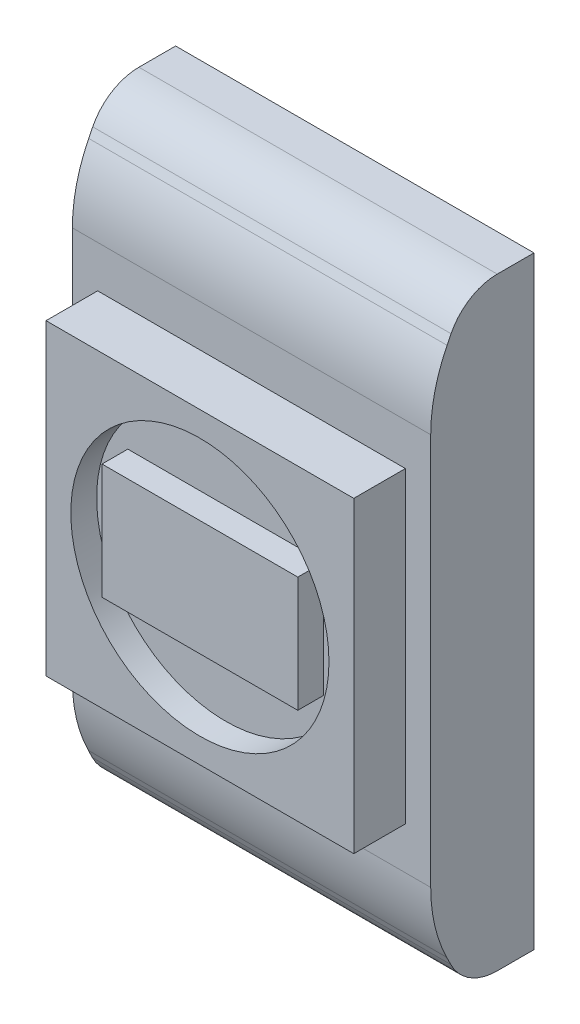
ISO-10303-21;
HEADER;
FILE_DESCRIPTION(('STEP AP214'),'2;1');
FILE_NAME('part.step','',(''),(''),'','','');
FILE_SCHEMA(('AUTOMOTIVE_DESIGN { 1 0 10303 214 1 1 1 1 }'));
ENDSEC;
DATA;
#1=APPLICATION_CONTEXT('core data for automotive mechanical design processes');
#2=APPLICATION_PROTOCOL_DEFINITION('international standard','automotive_design',2000,#1);
#3=PRODUCT_CONTEXT('',#1,'mechanical');
#4=PRODUCT('Part','Part','',(#3));
#5=PRODUCT_RELATED_PRODUCT_CATEGORY('part','',(#4));
#6=PRODUCT_DEFINITION_FORMATION('','',#4);
#7=PRODUCT_DEFINITION_CONTEXT('part definition',#1,'design');
#8=PRODUCT_DEFINITION('design','',#6,#7);
#9=PRODUCT_DEFINITION_SHAPE('','',#8);
#10=(LENGTH_UNIT() NAMED_UNIT(*) SI_UNIT(.MILLI.,.METRE.));
#11=(NAMED_UNIT(*) PLANE_ANGLE_UNIT() SI_UNIT($,.RADIAN.));
#12=(NAMED_UNIT(*) SI_UNIT($,.STERADIAN.) SOLID_ANGLE_UNIT());
#13=UNCERTAINTY_MEASURE_WITH_UNIT(LENGTH_MEASURE(1.E-05),#10,'distance_accuracy_value','');
#14=(GEOMETRIC_REPRESENTATION_CONTEXT(3) GLOBAL_UNCERTAINTY_ASSIGNED_CONTEXT((#13)) GLOBAL_UNIT_ASSIGNED_CONTEXT((#10,
#11,#12)) REPRESENTATION_CONTEXT('',''));
#15=CARTESIAN_POINT('',(0.,0.,0.));
#16=DIRECTION('',(0.,0.,1.));
#17=DIRECTION('',(1.,0.,0.));
#18=AXIS2_PLACEMENT_3D('',#15,#16,#17);
#19=CARTESIAN_POINT('',(0.,0.,0.5));
#20=DIRECTION('',(0.,0.,1.));
#21=DIRECTION('',(1.,0.,0.));
#22=AXIS2_PLACEMENT_3D('',#19,#20,#21);
#23=PLANE('',#22);
#24=CARTESIAN_POINT('',(0.,0.,0.5));
#25=DIRECTION('',(0.,0.,1.));
#26=DIRECTION('',(1.,0.,0.));
#27=AXIS2_PLACEMENT_3D('',#24,#25,#26);
#28=CIRCLE('',#27,2.5);
#29=CARTESIAN_POINT('',(2.5,0.,0.5));
#30=VERTEX_POINT('',#29);
#31=EDGE_CURVE('E197',#30,#30,#28,.T.);
#32=ORIENTED_EDGE('',*,*,#31,.T.);
#33=EDGE_LOOP('',(#32));
#34=FACE_BOUND('',#33,.T.);
#35=DIRECTION('',(1.,0.,0.));
#36=VECTOR('',#35,1.);
#37=CARTESIAN_POINT('',(-1.89583920539964,-1.11748368411723,0.5));
#38=LINE('',#37,#36);
#39=CARTESIAN_POINT('',(-1.89583920539964,-1.11748368411723,0.5));
#40=VERTEX_POINT('',#39);
#41=CARTESIAN_POINT('',(1.89583920539964,-1.11748368411723,0.5));
#42=VERTEX_POINT('',#41);
#43=EDGE_CURVE('E163',#40,#42,#38,.T.);
#44=ORIENTED_EDGE('',*,*,#43,.F.);
#45=DIRECTION('',(0.,1.,0.));
#46=VECTOR('',#45,1.);
#47=CARTESIAN_POINT('',(-1.89583920539964,-1.11748368411723,0.5));
#48=LINE('',#47,#46);
#49=CARTESIAN_POINT('',(-1.89583920539964,1.11748368411723,0.5));
#50=VERTEX_POINT('',#49);
#51=EDGE_CURVE('E55',#40,#50,#48,.T.);
#52=ORIENTED_EDGE('',*,*,#51,.T.);
#53=DIRECTION('',(1.,0.,0.));
#54=VECTOR('',#53,1.);
#55=CARTESIAN_POINT('',(-1.89583920539964,1.11748368411723,0.5));
#56=LINE('',#55,#54);
#57=CARTESIAN_POINT('',(1.89583920539964,1.11748368411723,0.5));
#58=VERTEX_POINT('',#57);
#59=EDGE_CURVE('E59',#50,#58,#56,.T.);
#60=ORIENTED_EDGE('',*,*,#59,.T.);
#61=DIRECTION('',(0.,1.,0.));
#62=VECTOR('',#61,1.);
#63=CARTESIAN_POINT('',(1.89583920539964,-1.11748368411723,0.5));
#64=LINE('',#63,#62);
#65=EDGE_CURVE('E160',#42,#58,#64,.T.);
#66=ORIENTED_EDGE('',*,*,#65,.F.);
#67=EDGE_LOOP('',(#44,#52,#60,#66));
#68=FACE_BOUND('',#67,.T.);
#69=ADVANCED_FACE('F40',(#34,#68),#23,.T.);
#70=CARTESIAN_POINT('',(0.,0.,0.));
#71=DIRECTION('',(0.,0.,1.));
#72=DIRECTION('',(1.,0.,0.));
#73=AXIS2_PLACEMENT_3D('',#70,#71,#72);
#74=PLANE('',#73);
#75=DIRECTION('',(0.,-1.,0.));
#76=VECTOR('',#75,1.);
#77=CARTESIAN_POINT('',(3.47,4.5,0.));
#78=LINE('',#77,#76);
#79=CARTESIAN_POINT('',(3.47,3.7919356750098,0.));
#80=VERTEX_POINT('',#79);
#81=CARTESIAN_POINT('',(3.47,-3.80022207023988,0.));
#82=VERTEX_POINT('',#81);
#83=EDGE_CURVE('E265',#80,#82,#78,.T.);
#84=ORIENTED_EDGE('',*,*,#83,.F.);
#85=DIRECTION('',(-1.,0.,0.));
#86=VECTOR('',#85,1.);
#87=CARTESIAN_POINT('',(0.,3.7919356750098,0.));
#88=LINE('',#87,#86);
#89=CARTESIAN_POINT('',(-3.47,3.7919356750098,0.));
#90=VERTEX_POINT('',#89);
#91=EDGE_CURVE('E292',#80,#90,#88,.T.);
#92=ORIENTED_EDGE('',*,*,#91,.T.);
#93=DIRECTION('',(0.,-1.,0.));
#94=VECTOR('',#93,1.);
#95=CARTESIAN_POINT('',(-3.47,4.5,0.));
#96=LINE('',#95,#94);
#97=CARTESIAN_POINT('',(-3.47,-3.80022207023988,0.));
#98=VERTEX_POINT('',#97);
#99=EDGE_CURVE('E261',#90,#98,#96,.T.);
#100=ORIENTED_EDGE('',*,*,#99,.T.);
#101=DIRECTION('',(-1.,0.,0.));
#102=VECTOR('',#101,1.);
#103=CARTESIAN_POINT('',(0.,-3.80022207023988,0.));
#104=LINE('',#103,#102);
#105=EDGE_CURVE('E273',#98,#82,#104,.F.);
#106=ORIENTED_EDGE('',*,*,#105,.T.);
#107=EDGE_LOOP('',(#84,#92,#100,#106));
#108=FACE_BOUND('',#107,.T.);
#109=DIRECTION('',(1.,0.,0.));
#110=VECTOR('',#109,1.);
#111=CARTESIAN_POINT('',(-2.98,-2.98,0.));
#112=LINE('',#111,#110);
#113=CARTESIAN_POINT('',(-2.98,-2.98,0.));
#114=VERTEX_POINT('',#113);
#115=CARTESIAN_POINT('',(2.98,-2.98,0.));
#116=VERTEX_POINT('',#115);
#117=EDGE_CURVE('E218',#114,#116,#112,.T.);
#118=ORIENTED_EDGE('',*,*,#117,.F.);
#119=DIRECTION('',(0.,-1.,0.));
#120=VECTOR('',#119,1.);
#121=CARTESIAN_POINT('',(-2.98,2.98,0.));
#122=LINE('',#121,#120);
#123=CARTESIAN_POINT('',(-2.98,2.98,0.));
#124=VERTEX_POINT('',#123);
#125=EDGE_CURVE('E200',#124,#114,#122,.T.);
#126=ORIENTED_EDGE('',*,*,#125,.F.);
#127=DIRECTION('',(1.,0.,0.));
#128=VECTOR('',#127,1.);
#129=CARTESIAN_POINT('',(-2.98,2.98,0.));
#130=LINE('',#129,#128);
#131=CARTESIAN_POINT('',(2.98,2.98,0.));
#132=VERTEX_POINT('',#131);
#133=EDGE_CURVE('E207',#124,#132,#130,.T.);
#134=ORIENTED_EDGE('',*,*,#133,.T.);
#135=DIRECTION('',(0.,-1.,0.));
#136=VECTOR('',#135,1.);
#137=CARTESIAN_POINT('',(2.98,2.98,0.));
#138=LINE('',#137,#136);
#139=EDGE_CURVE('E221',#132,#116,#138,.T.);
#140=ORIENTED_EDGE('',*,*,#139,.T.);
#141=EDGE_LOOP('',(#118,#126,#134,#140));
#142=FACE_BOUND('',#141,.T.);
#143=ADVANCED_FACE('F330',(#108,#142),#74,.T.);
#144=CARTESIAN_POINT('',(0.,4.84169992059135,-1.28879701927679));
#145=DIRECTION('',(1.,0.,0.));
#146=DIRECTION('',(0.,0.,-1.));
#147=AXIS2_PLACEMENT_3D('',#144,#145,#146);
#148=CYLINDRICAL_SURFACE('',#147,1.);
#149=DIRECTION('',(-1.,0.,0.));
#150=VECTOR('',#149,1.);
#151=CARTESIAN_POINT('',(0.,5.28883466194651,-0.394330405549231));
#152=LINE('',#151,#150);
#153=CARTESIAN_POINT('',(3.47,5.28883466194651,-0.394330405549231));
#154=VERTEX_POINT('',#153);
#155=CARTESIAN_POINT('',(-3.47,5.28883466194651,-0.394330405549231));
#156=VERTEX_POINT('',#155);
#157=EDGE_CURVE('E302',#154,#156,#152,.T.);
#158=ORIENTED_EDGE('',*,*,#157,.F.);
#159=CARTESIAN_POINT('',(3.47,4.84169992059135,-1.28879701927679));
#160=DIRECTION('',(-1.,0.,0.));
#161=DIRECTION('',(0.,0.,1.));
#162=AXIS2_PLACEMENT_3D('',#159,#160,#161);
#163=CIRCLE('',#162,1.);
#164=CARTESIAN_POINT('',(3.47,5.84169992059135,-1.28879701927679));
#165=VERTEX_POINT('',#164);
#166=EDGE_CURVE('E48',#165,#154,#163,.F.);
#167=ORIENTED_EDGE('',*,*,#166,.F.);
#168=DIRECTION('',(-1.,0.,0.));
#169=VECTOR('',#168,1.);
#170=CARTESIAN_POINT('',(0.,5.84169992059135,-1.28879701927679));
#171=LINE('',#170,#169);
#172=CARTESIAN_POINT('',(-3.47,5.84169992059135,-1.28879701927679));
#173=VERTEX_POINT('',#172);
#174=EDGE_CURVE('E305',#173,#165,#171,.F.);
#175=ORIENTED_EDGE('',*,*,#174,.F.);
#176=CARTESIAN_POINT('',(-3.47,4.84169992059135,-1.28879701927679));
#177=DIRECTION('',(-1.,0.,0.));
#178=DIRECTION('',(0.,0.,1.));
#179=AXIS2_PLACEMENT_3D('',#176,#177,#178);
#180=CIRCLE('',#179,1.);
#181=EDGE_CURVE('E11',#156,#173,#180,.T.);
#182=ORIENTED_EDGE('',*,*,#181,.F.);
#183=EDGE_LOOP('',(#158,#167,#175,#182));
#184=FACE_BOUND('',#183,.T.);
#185=ADVANCED_FACE('F42',(#184),#148,.T.);
#186=CARTESIAN_POINT('',(0.,3.7919356750098,-3.));
#187=DIRECTION('',(1.,0.,0.));
#188=DIRECTION('',(0.,0.,-1.));
#189=AXIS2_PLACEMENT_3D('',#186,#187,#188);
#190=CYLINDRICAL_SURFACE('',#189,3.);
#191=ORIENTED_EDGE('',*,*,#91,.F.);
#192=CARTESIAN_POINT('',(3.47,3.7919356750098,-3.));
#193=DIRECTION('',(-1.,0.,0.));
#194=DIRECTION('',(0.,0.,1.));
#195=AXIS2_PLACEMENT_3D('',#192,#193,#194);
#196=CIRCLE('',#195,3.);
#197=CARTESIAN_POINT('',(3.47,5.13333989907528,-0.316600158817312));
#198=VERTEX_POINT('',#197);
#199=EDGE_CURVE('E298',#198,#80,#196,.F.);
#200=ORIENTED_EDGE('',*,*,#199,.F.);
#201=DIRECTION('',(-1.,0.,0.));
#202=VECTOR('',#201,1.);
#203=CARTESIAN_POINT('',(0.,5.13333989907528,-0.316600158817312));
#204=LINE('',#203,#202);
#205=CARTESIAN_POINT('',(-3.47,5.13333989907528,-0.316600158817312));
#206=VERTEX_POINT('',#205);
#207=EDGE_CURVE('E295',#206,#198,#204,.F.);
#208=ORIENTED_EDGE('',*,*,#207,.F.);
#209=CARTESIAN_POINT('',(-3.47,3.7919356750098,-3.));
#210=DIRECTION('',(-1.,0.,0.));
#211=DIRECTION('',(0.,0.,1.));
#212=AXIS2_PLACEMENT_3D('',#209,#210,#211);
#213=CIRCLE('',#212,3.);
#214=EDGE_CURVE('E300',#90,#206,#213,.T.);
#215=ORIENTED_EDGE('',*,*,#214,.F.);
#216=EDGE_LOOP('',(#191,#200,#208,#215));
#217=FACE_BOUND('',#216,.T.);
#218=ADVANCED_FACE('F321',(#217),#190,.T.);
#219=CARTESIAN_POINT('',(0.,-4.84519330090106,-1.28538678150257));
#220=DIRECTION('',(1.,0.,0.));
#221=DIRECTION('',(0.,0.,-1.));
#222=AXIS2_PLACEMENT_3D('',#219,#220,#221);
#223=CYLINDRICAL_SURFACE('',#222,1.);
#224=DIRECTION('',(1.,0.,0.));
#225=VECTOR('',#224,1.);
#226=CARTESIAN_POINT('',(0.,-5.28763851820593,-0.388591247568523));
#227=LINE('',#226,#225);
#228=CARTESIAN_POINT('',(-3.47,-5.28763851820593,-0.388591247568524));
#229=VERTEX_POINT('',#228);
#230=CARTESIAN_POINT('',(3.47,-5.28763851820593,-0.388591247568524));
#231=VERTEX_POINT('',#230);
#232=EDGE_CURVE('E282',#229,#231,#227,.T.);
#233=ORIENTED_EDGE('',*,*,#232,.F.);
#234=CARTESIAN_POINT('',(-3.47,-4.84519330090106,-1.28538678150257));
#235=DIRECTION('',(-1.,0.,0.));
#236=DIRECTION('',(0.,0.,1.));
#237=AXIS2_PLACEMENT_3D('',#234,#235,#236);
#238=CIRCLE('',#237,1.);
#239=CARTESIAN_POINT('',(-3.47,-5.84519330090106,-1.28538678150257));
#240=VERTEX_POINT('',#239);
#241=EDGE_CURVE('E288',#240,#229,#238,.T.);
#242=ORIENTED_EDGE('',*,*,#241,.F.);
#243=DIRECTION('',(1.,0.,0.));
#244=VECTOR('',#243,1.);
#245=CARTESIAN_POINT('',(5.36613519986597,-5.84519330090106,-1.28538678150257));
#246=LINE('',#245,#244);
#247=CARTESIAN_POINT('',(3.47,-5.84519330090106,-1.28538678150257));
#248=VERTEX_POINT('',#247);
#249=EDGE_CURVE('E285',#248,#240,#246,.F.);
#250=ORIENTED_EDGE('',*,*,#249,.F.);
#251=CARTESIAN_POINT('',(3.47,-4.84519330090106,-1.28538678150257));
#252=DIRECTION('',(-1.,0.,0.));
#253=DIRECTION('',(0.,0.,1.));
#254=AXIS2_PLACEMENT_3D('',#251,#252,#253);
#255=CIRCLE('',#254,1.);
#256=EDGE_CURVE('E290',#231,#248,#255,.F.);
#257=ORIENTED_EDGE('',*,*,#256,.F.);
#258=EDGE_LOOP('',(#233,#242,#250,#257));
#259=FACE_BOUND('',#258,.T.);
#260=ADVANCED_FACE('F342',(#259),#223,.T.);
#261=CARTESIAN_POINT('',(0.,-3.80022207023988,-3.));
#262=DIRECTION('',(-1.,0.,0.));
#263=DIRECTION('',(0.,0.,1.));
#264=AXIS2_PLACEMENT_3D('',#261,#262,#263);
#265=CYLINDRICAL_SURFACE('',#264,3.);
#266=DIRECTION('',(-1.,0.,0.));
#267=VECTOR('',#266,1.);
#268=CARTESIAN_POINT('',(0.,-5.12755772215449,-0.30961339819787));
#269=LINE('',#268,#267);
#270=CARTESIAN_POINT('',(3.47,-5.12755772215449,-0.309613398197869));
#271=VERTEX_POINT('',#270);
#272=CARTESIAN_POINT('',(-3.47,-5.12755772215449,-0.309613398197869));
#273=VERTEX_POINT('',#272);
#274=EDGE_CURVE('E268',#271,#273,#269,.T.);
#275=ORIENTED_EDGE('',*,*,#274,.F.);
#276=CARTESIAN_POINT('',(3.47,-3.80022207023988,-3.));
#277=DIRECTION('',(-1.,0.,0.));
#278=DIRECTION('',(0.,0.,1.));
#279=AXIS2_PLACEMENT_3D('',#276,#277,#278);
#280=CIRCLE('',#279,3.);
#281=EDGE_CURVE('E276',#82,#271,#280,.F.);
#282=ORIENTED_EDGE('',*,*,#281,.F.);
#283=ORIENTED_EDGE('',*,*,#105,.F.);
#284=CARTESIAN_POINT('',(-3.47,-3.80022207023988,-3.));
#285=DIRECTION('',(-1.,0.,0.));
#286=DIRECTION('',(0.,0.,1.));
#287=AXIS2_PLACEMENT_3D('',#284,#285,#286);
#288=CIRCLE('',#287,3.);
#289=EDGE_CURVE('E279',#273,#98,#288,.T.);
#290=ORIENTED_EDGE('',*,*,#289,.F.);
#291=EDGE_LOOP('',(#275,#282,#283,#290));
#292=FACE_BOUND('',#291,.T.);
#293=ADVANCED_FACE('F329',(#292),#265,.T.);
#294=CARTESIAN_POINT('',(-3.47,4.5,-2.));
#295=DIRECTION('',(-1.,0.,0.));
#296=DIRECTION('',(0.,0.,1.));
#297=AXIS2_PLACEMENT_3D('',#294,#295,#296);
#298=PLANE('',#297);
#299=DIRECTION('',(0.,0.894466613727563,-0.447134741355162));
#300=VECTOR('',#299,1.);
#301=CARTESIAN_POINT('',(-3.47,4.5,0.));
#302=LINE('',#301,#300);
#303=EDGE_CURVE('E256',#206,#156,#302,.T.);
#304=ORIENTED_EDGE('',*,*,#303,.T.);
#305=ORIENTED_EDGE('',*,*,#181,.T.);
#306=DIRECTION('',(0.,0.,-1.));
#307=VECTOR('',#306,1.);
#308=CARTESIAN_POINT('',(-3.47,5.84169992059135,-0.670702112032743));
#309=LINE('',#308,#307);
#310=CARTESIAN_POINT('',(-3.47,5.84169992059135,-2.));
#311=VERTEX_POINT('',#310);
#312=EDGE_CURVE('E243',#173,#311,#309,.T.);
#313=ORIENTED_EDGE('',*,*,#312,.T.);
#314=DIRECTION('',(0.,-1.,0.));
#315=VECTOR('',#314,1.);
#316=CARTESIAN_POINT('',(-3.47,4.5,-2.));
#317=LINE('',#316,#315);
#318=CARTESIAN_POINT('',(-3.47,-5.84519330090106,-2.));
#319=VERTEX_POINT('',#318);
#320=EDGE_CURVE('E262',#311,#319,#317,.T.);
#321=ORIENTED_EDGE('',*,*,#320,.T.);
#322=DIRECTION('',(0.,0.,1.));
#323=VECTOR('',#322,1.);
#324=CARTESIAN_POINT('',(-3.47,-5.84519330090106,-0.663667825957305));
#325=LINE('',#324,#323);
#326=EDGE_CURVE('E240',#319,#240,#325,.T.);
#327=ORIENTED_EDGE('',*,*,#326,.T.);
#328=ORIENTED_EDGE('',*,*,#241,.T.);
#329=DIRECTION('',(0.,-0.896795533934043,-0.44244521730487));
#330=VECTOR('',#329,1.);
#331=CARTESIAN_POINT('',(-3.47,-4.5,0.));
#332=LINE('',#331,#330);
#333=EDGE_CURVE('E247',#273,#229,#332,.T.);
#334=ORIENTED_EDGE('',*,*,#333,.F.);
#335=ORIENTED_EDGE('',*,*,#289,.T.);
#336=ORIENTED_EDGE('',*,*,#99,.F.);
#337=ORIENTED_EDGE('',*,*,#214,.T.);
#338=EDGE_LOOP('',(#304,#305,#313,#321,#327,#328,#334,#335,#336,#337));
#339=FACE_BOUND('',#338,.T.);
#340=ADVANCED_FACE('F335',(#339),#298,.T.);
#341=CARTESIAN_POINT('',(3.47,4.5,-2.));
#342=DIRECTION('',(-1.,0.,0.));
#343=DIRECTION('',(0.,0.,1.));
#344=AXIS2_PLACEMENT_3D('',#341,#342,#343);
#345=PLANE('',#344);
#346=DIRECTION('',(0.,0.,1.));
#347=VECTOR('',#346,1.);
#348=CARTESIAN_POINT('',(3.47,5.84169992059135,-0.670702112032743));
#349=LINE('',#348,#347);
#350=CARTESIAN_POINT('',(3.47,5.84169992059135,-2.));
#351=VERTEX_POINT('',#350);
#352=EDGE_CURVE('E244',#351,#165,#349,.T.);
#353=ORIENTED_EDGE('',*,*,#352,.T.);
#354=ORIENTED_EDGE('',*,*,#166,.T.);
#355=DIRECTION('',(0.,-0.894466613727563,0.447134741355162));
#356=VECTOR('',#355,1.);
#357=CARTESIAN_POINT('',(3.47,4.5,0.));
#358=LINE('',#357,#356);
#359=EDGE_CURVE('E259',#154,#198,#358,.T.);
#360=ORIENTED_EDGE('',*,*,#359,.T.);
#361=ORIENTED_EDGE('',*,*,#199,.T.);
#362=ORIENTED_EDGE('',*,*,#83,.T.);
#363=ORIENTED_EDGE('',*,*,#281,.T.);
#364=DIRECTION('',(0.,0.896795533934043,0.44244521730487));
#365=VECTOR('',#364,1.);
#366=CARTESIAN_POINT('',(3.47,-4.5,0.));
#367=LINE('',#366,#365);
#368=EDGE_CURVE('E254',#231,#271,#367,.T.);
#369=ORIENTED_EDGE('',*,*,#368,.F.);
#370=ORIENTED_EDGE('',*,*,#256,.T.);
#371=DIRECTION('',(0.,0.,-1.));
#372=VECTOR('',#371,1.);
#373=CARTESIAN_POINT('',(3.47,-5.84519330090106,-0.663667825957305));
#374=LINE('',#373,#372);
#375=CARTESIAN_POINT('',(3.47,-5.84519330090106,-2.));
#376=VERTEX_POINT('',#375);
#377=EDGE_CURVE('E235',#248,#376,#374,.T.);
#378=ORIENTED_EDGE('',*,*,#377,.T.);
#379=DIRECTION('',(0.,-1.,0.));
#380=VECTOR('',#379,1.);
#381=CARTESIAN_POINT('',(3.47,4.5,-2.));
#382=LINE('',#381,#380);
#383=EDGE_CURVE('E264',#351,#376,#382,.T.);
#384=ORIENTED_EDGE('',*,*,#383,.F.);
#385=EDGE_LOOP('',(#353,#354,#360,#361,#362,#363,#369,#370,#378,#384));
#386=FACE_BOUND('',#385,.T.);
#387=ADVANCED_FACE('F309',(#386),#345,.F.);
#388=CARTESIAN_POINT('',(0.,0.,-2.));
#389=DIRECTION('',(0.,0.,1.));
#390=DIRECTION('',(1.,0.,0.));
#391=AXIS2_PLACEMENT_3D('',#388,#389,#390);
#392=PLANE('',#391);
#393=ORIENTED_EDGE('',*,*,#320,.F.);
#394=DIRECTION('',(-1.,0.,0.));
#395=VECTOR('',#394,1.);
#396=CARTESIAN_POINT('',(5.36613519986597,5.84169992059135,-2.));
#397=LINE('',#396,#395);
#398=EDGE_CURVE('E248',#351,#311,#397,.T.);
#399=ORIENTED_EDGE('',*,*,#398,.F.);
#400=ORIENTED_EDGE('',*,*,#383,.T.);
#401=DIRECTION('',(-1.,0.,0.));
#402=VECTOR('',#401,1.);
#403=CARTESIAN_POINT('',(5.36613519986597,-5.84519330090106,-2.));
#404=LINE('',#403,#402);
#405=EDGE_CURVE('E237',#376,#319,#404,.T.);
#406=ORIENTED_EDGE('',*,*,#405,.T.);
#407=EDGE_LOOP('',(#393,#399,#400,#406));
#408=FACE_BOUND('',#407,.T.);
#409=ADVANCED_FACE('F349',(#408),#392,.F.);
#410=CARTESIAN_POINT('',(0.,0.899682646170363,1.79976194090956));
#411=DIRECTION('',(0.,-0.447134741355162,-0.894466613727563));
#412=DIRECTION('',(0.,0.894466613727563,-0.447134741355162));
#413=AXIS2_PLACEMENT_3D('',#410,#411,#412);
#414=PLANE('',#413);
#415=ORIENTED_EDGE('',*,*,#359,.F.);
#416=ORIENTED_EDGE('',*,*,#157,.T.);
#417=ORIENTED_EDGE('',*,*,#303,.F.);
#418=ORIENTED_EDGE('',*,*,#207,.T.);
#419=EDGE_LOOP('',(#415,#416,#417,#418));
#420=FACE_BOUND('',#419,.T.);
#421=ADVANCED_FACE('F317',(#420),#414,.F.);
#422=CARTESIAN_POINT('',(0.,-0.880909966421794,1.78552302700268));
#423=DIRECTION('',(0.,-0.442445217304871,0.896795533934044));
#424=DIRECTION('',(0.,-0.896795533934043,-0.44244521730487));
#425=AXIS2_PLACEMENT_3D('',#422,#423,#424);
#426=PLANE('',#425);
#427=ORIENTED_EDGE('',*,*,#333,.T.);
#428=ORIENTED_EDGE('',*,*,#232,.T.);
#429=ORIENTED_EDGE('',*,*,#368,.T.);
#430=ORIENTED_EDGE('',*,*,#274,.T.);
#431=EDGE_LOOP('',(#427,#428,#429,#430));
#432=FACE_BOUND('',#431,.T.);
#433=ADVANCED_FACE('F337',(#432),#426,.T.);
#434=CARTESIAN_POINT('',(5.36613519986597,5.84169992059135,-0.670702112032743));
#435=DIRECTION('',(0.,1.,0.));
#436=DIRECTION('',(0.,0.,1.));
#437=AXIS2_PLACEMENT_3D('',#434,#435,#436);
#438=PLANE('',#437);
#439=ORIENTED_EDGE('',*,*,#312,.F.);
#440=ORIENTED_EDGE('',*,*,#174,.T.);
#441=ORIENTED_EDGE('',*,*,#352,.F.);
#442=ORIENTED_EDGE('',*,*,#398,.T.);
#443=EDGE_LOOP('',(#439,#440,#441,#442));
#444=FACE_BOUND('',#443,.T.);
#445=ADVANCED_FACE('F353',(#444),#438,.T.);
#446=CARTESIAN_POINT('',(5.36613519986597,-5.84519330090106,-0.663667825957305));
#447=DIRECTION('',(0.,-1.,0.));
#448=DIRECTION('',(0.,0.,-1.));
#449=AXIS2_PLACEMENT_3D('',#446,#447,#448);
#450=PLANE('',#449);
#451=ORIENTED_EDGE('',*,*,#377,.F.);
#452=ORIENTED_EDGE('',*,*,#249,.T.);
#453=ORIENTED_EDGE('',*,*,#326,.F.);
#454=ORIENTED_EDGE('',*,*,#405,.F.);
#455=EDGE_LOOP('',(#451,#452,#453,#454));
#456=FACE_BOUND('',#455,.T.);
#457=ADVANCED_FACE('F346',(#456),#450,.T.);
#458=CARTESIAN_POINT('',(-2.98,2.98,1.));
#459=DIRECTION('',(1.,0.,0.));
#460=DIRECTION('',(0.,1.,0.));
#461=AXIS2_PLACEMENT_3D('',#458,#459,#460);
#462=PLANE('',#461);
#463=ORIENTED_EDGE('',*,*,#125,.T.);
#464=DIRECTION('',(0.,0.,-1.));
#465=VECTOR('',#464,1.);
#466=CARTESIAN_POINT('',(-2.98,-2.98,1.));
#467=LINE('',#466,#465);
#468=CARTESIAN_POINT('',(-2.98,-2.98,1.));
#469=VERTEX_POINT('',#468);
#470=EDGE_CURVE('E232',#469,#114,#467,.T.);
#471=ORIENTED_EDGE('',*,*,#470,.F.);
#472=DIRECTION('',(0.,-1.,0.));
#473=VECTOR('',#472,1.);
#474=CARTESIAN_POINT('',(-2.98,2.98,1.));
#475=LINE('',#474,#473);
#476=CARTESIAN_POINT('',(-2.98,2.98,1.));
#477=VERTEX_POINT('',#476);
#478=EDGE_CURVE('E203',#477,#469,#475,.T.);
#479=ORIENTED_EDGE('',*,*,#478,.F.);
#480=DIRECTION('',(0.,0.,-1.));
#481=VECTOR('',#480,1.);
#482=CARTESIAN_POINT('',(-2.98,2.98,1.));
#483=LINE('',#482,#481);
#484=EDGE_CURVE('E215',#477,#124,#483,.T.);
#485=ORIENTED_EDGE('',*,*,#484,.T.);
#486=EDGE_LOOP('',(#463,#471,#479,#485));
#487=FACE_BOUND('',#486,.T.);
#488=ADVANCED_FACE('F360',(#487),#462,.F.);
#489=CARTESIAN_POINT('',(-2.98,-2.98,1.));
#490=DIRECTION('',(0.,1.,0.));
#491=DIRECTION('',(0.,0.,1.));
#492=AXIS2_PLACEMENT_3D('',#489,#490,#491);
#493=PLANE('',#492);
#494=ORIENTED_EDGE('',*,*,#117,.T.);
#495=DIRECTION('',(0.,0.,-1.));
#496=VECTOR('',#495,1.);
#497=CARTESIAN_POINT('',(2.98,-2.98,1.));
#498=LINE('',#497,#496);
#499=CARTESIAN_POINT('',(2.98,-2.98,1.));
#500=VERTEX_POINT('',#499);
#501=EDGE_CURVE('E229',#500,#116,#498,.T.);
#502=ORIENTED_EDGE('',*,*,#501,.F.);
#503=DIRECTION('',(1.,0.,0.));
#504=VECTOR('',#503,1.);
#505=CARTESIAN_POINT('',(-2.98,-2.98,1.));
#506=LINE('',#505,#504);
#507=EDGE_CURVE('E206',#469,#500,#506,.T.);
#508=ORIENTED_EDGE('',*,*,#507,.F.);
#509=ORIENTED_EDGE('',*,*,#470,.T.);
#510=EDGE_LOOP('',(#494,#502,#508,#509));
#511=FACE_BOUND('',#510,.T.);
#512=ADVANCED_FACE('F389',(#511),#493,.F.);
#513=CARTESIAN_POINT('',(2.98,2.98,1.));
#514=DIRECTION('',(1.,0.,0.));
#515=DIRECTION('',(0.,1.,0.));
#516=AXIS2_PLACEMENT_3D('',#513,#514,#515);
#517=PLANE('',#516);
#518=ORIENTED_EDGE('',*,*,#139,.F.);
#519=DIRECTION('',(0.,0.,-1.));
#520=VECTOR('',#519,1.);
#521=CARTESIAN_POINT('',(2.98,2.98,1.));
#522=LINE('',#521,#520);
#523=CARTESIAN_POINT('',(2.98,2.98,1.));
#524=VERTEX_POINT('',#523);
#525=EDGE_CURVE('E226',#524,#132,#522,.T.);
#526=ORIENTED_EDGE('',*,*,#525,.F.);
#527=DIRECTION('',(0.,-1.,0.));
#528=VECTOR('',#527,1.);
#529=CARTESIAN_POINT('',(2.98,2.98,1.));
#530=LINE('',#529,#528);
#531=EDGE_CURVE('E209',#524,#500,#530,.T.);
#532=ORIENTED_EDGE('',*,*,#531,.T.);
#533=ORIENTED_EDGE('',*,*,#501,.T.);
#534=EDGE_LOOP('',(#518,#526,#532,#533));
#535=FACE_BOUND('',#534,.T.);
#536=ADVANCED_FACE('F385',(#535),#517,.T.);
#537=CARTESIAN_POINT('',(-2.98,2.98,1.));
#538=DIRECTION('',(0.,1.,0.));
#539=DIRECTION('',(0.,0.,1.));
#540=AXIS2_PLACEMENT_3D('',#537,#538,#539);
#541=PLANE('',#540);
#542=ORIENTED_EDGE('',*,*,#133,.F.);
#543=ORIENTED_EDGE('',*,*,#484,.F.);
#544=DIRECTION('',(1.,0.,0.));
#545=VECTOR('',#544,1.);
#546=CARTESIAN_POINT('',(-2.98,2.98,1.));
#547=LINE('',#546,#545);
#548=EDGE_CURVE('E212',#477,#524,#547,.T.);
#549=ORIENTED_EDGE('',*,*,#548,.T.);
#550=ORIENTED_EDGE('',*,*,#525,.T.);
#551=EDGE_LOOP('',(#542,#543,#549,#550));
#552=FACE_BOUND('',#551,.T.);
#553=ADVANCED_FACE('F381',(#552),#541,.T.);
#554=CARTESIAN_POINT('',(0.,0.,1.));
#555=DIRECTION('',(0.,0.,1.));
#556=DIRECTION('',(1.,0.,0.));
#557=AXIS2_PLACEMENT_3D('',#554,#555,#556);
#558=PLANE('',#557);
#559=CARTESIAN_POINT('',(0.,0.,1.));
#560=DIRECTION('',(0.,0.,1.));
#561=DIRECTION('',(1.,0.,0.));
#562=AXIS2_PLACEMENT_3D('',#559,#560,#561);
#563=CIRCLE('',#562,2.5);
#564=CARTESIAN_POINT('',(2.5,0.,1.));
#565=VERTEX_POINT('',#564);
#566=EDGE_CURVE('E196',#565,#565,#563,.T.);
#567=ORIENTED_EDGE('',*,*,#566,.F.);
#568=EDGE_LOOP('',(#567));
#569=FACE_BOUND('',#568,.T.);
#570=ORIENTED_EDGE('',*,*,#478,.T.);
#571=ORIENTED_EDGE('',*,*,#507,.T.);
#572=ORIENTED_EDGE('',*,*,#531,.F.);
#573=ORIENTED_EDGE('',*,*,#548,.F.);
#574=EDGE_LOOP('',(#570,#571,#572,#573));
#575=FACE_BOUND('',#574,.T.);
#576=ADVANCED_FACE('F377',(#569,#575),#558,.T.);
#577=CARTESIAN_POINT('',(0.,0.,0.5));
#578=DIRECTION('',(0.,0.,1.));
#579=DIRECTION('',(1.,0.,0.));
#580=AXIS2_PLACEMENT_3D('',#577,#578,#579);
#581=CYLINDRICAL_SURFACE('',#580,2.5);
#582=ORIENTED_EDGE('',*,*,#31,.F.);
#583=EDGE_LOOP('',(#582));
#584=FACE_BOUND('',#583,.T.);
#585=ORIENTED_EDGE('',*,*,#566,.T.);
#586=EDGE_LOOP('',(#585));
#587=FACE_BOUND('',#586,.T.);
#588=ADVANCED_FACE('F374',(#584,#587),#581,.F.);
#589=CARTESIAN_POINT('',(-1.89583920539964,-1.11748368411723,0.5));
#590=DIRECTION('',(1.,0.,0.));
#591=DIRECTION('',(0.,0.,-1.));
#592=AXIS2_PLACEMENT_3D('',#589,#590,#591);
#593=PLANE('',#592);
#594=DIRECTION('',(0.,1.,0.));
#595=VECTOR('',#594,1.);
#596=CARTESIAN_POINT('',(-1.89583920539964,-1.11748368411723,1.));
#597=LINE('',#596,#595);
#598=CARTESIAN_POINT('',(-1.89583920539964,-1.11748368411723,1.));
#599=VERTEX_POINT('',#598);
#600=CARTESIAN_POINT('',(-1.89583920539964,1.11748368411723,1.));
#601=VERTEX_POINT('',#600);
#602=EDGE_CURVE('E183',#599,#601,#597,.T.);
#603=ORIENTED_EDGE('',*,*,#602,.T.);
#604=DIRECTION('',(0.,0.,1.));
#605=VECTOR('',#604,1.);
#606=CARTESIAN_POINT('',(-1.89583920539964,1.11748368411723,0.5));
#607=LINE('',#606,#605);
#608=EDGE_CURVE('E193',#50,#601,#607,.T.);
#609=ORIENTED_EDGE('',*,*,#608,.F.);
#610=ORIENTED_EDGE('',*,*,#51,.F.);
#611=DIRECTION('',(0.,0.,1.));
#612=VECTOR('',#611,1.);
#613=CARTESIAN_POINT('',(-1.89583920539964,-1.11748368411723,0.5));
#614=LINE('',#613,#612);
#615=EDGE_CURVE('E176',#40,#599,#614,.T.);
#616=ORIENTED_EDGE('',*,*,#615,.T.);
#617=EDGE_LOOP('',(#603,#609,#610,#616));
#618=FACE_BOUND('',#617,.T.);
#619=ADVANCED_FACE('F372',(#618),#593,.F.);
#620=CARTESIAN_POINT('',(-1.89583920539964,1.11748368411723,0.5));
#621=DIRECTION('',(0.,-1.,0.));
#622=DIRECTION('',(0.,0.,-1.));
#623=AXIS2_PLACEMENT_3D('',#620,#621,#622);
#624=PLANE('',#623);
#625=DIRECTION('',(1.,0.,0.));
#626=VECTOR('',#625,1.);
#627=CARTESIAN_POINT('',(-1.89583920539964,1.11748368411723,1.));
#628=LINE('',#627,#626);
#629=CARTESIAN_POINT('',(1.89583920539964,1.11748368411723,1.));
#630=VERTEX_POINT('',#629);
#631=EDGE_CURVE('E186',#601,#630,#628,.T.);
#632=ORIENTED_EDGE('',*,*,#631,.T.);
#633=DIRECTION('',(0.,0.,1.));
#634=VECTOR('',#633,1.);
#635=CARTESIAN_POINT('',(1.89583920539964,1.11748368411723,0.5));
#636=LINE('',#635,#634);
#637=EDGE_CURVE('E175',#58,#630,#636,.T.);
#638=ORIENTED_EDGE('',*,*,#637,.F.);
#639=ORIENTED_EDGE('',*,*,#59,.F.);
#640=ORIENTED_EDGE('',*,*,#608,.T.);
#641=EDGE_LOOP('',(#632,#638,#639,#640));
#642=FACE_BOUND('',#641,.T.);
#643=ADVANCED_FACE('F436',(#642),#624,.F.);
#644=CARTESIAN_POINT('',(1.89583920539964,-1.11748368411723,0.5));
#645=DIRECTION('',(1.,0.,0.));
#646=DIRECTION('',(0.,0.,-1.));
#647=AXIS2_PLACEMENT_3D('',#644,#645,#646);
#648=PLANE('',#647);
#649=DIRECTION('',(0.,1.,0.));
#650=VECTOR('',#649,1.);
#651=CARTESIAN_POINT('',(1.89583920539964,-1.11748368411723,1.));
#652=LINE('',#651,#650);
#653=CARTESIAN_POINT('',(1.89583920539964,-1.11748368411723,1.));
#654=VERTEX_POINT('',#653);
#655=EDGE_CURVE('E171',#654,#630,#652,.T.);
#656=ORIENTED_EDGE('',*,*,#655,.F.);
#657=DIRECTION('',(0.,0.,1.));
#658=VECTOR('',#657,1.);
#659=CARTESIAN_POINT('',(1.89583920539964,-1.11748368411723,0.5));
#660=LINE('',#659,#658);
#661=EDGE_CURVE('E168',#42,#654,#660,.T.);
#662=ORIENTED_EDGE('',*,*,#661,.F.);
#663=ORIENTED_EDGE('',*,*,#65,.T.);
#664=ORIENTED_EDGE('',*,*,#637,.T.);
#665=EDGE_LOOP('',(#656,#662,#663,#664));
#666=FACE_BOUND('',#665,.T.);
#667=ADVANCED_FACE('F169',(#666),#648,.T.);
#668=CARTESIAN_POINT('',(-1.89583920539964,-1.11748368411723,0.5));
#669=DIRECTION('',(0.,-1.,0.));
#670=DIRECTION('',(0.,0.,-1.));
#671=AXIS2_PLACEMENT_3D('',#668,#669,#670);
#672=PLANE('',#671);
#673=DIRECTION('',(1.,0.,0.));
#674=VECTOR('',#673,1.);
#675=CARTESIAN_POINT('',(-1.89583920539964,-1.11748368411723,1.));
#676=LINE('',#675,#674);
#677=EDGE_CURVE('E190',#599,#654,#676,.T.);
#678=ORIENTED_EDGE('',*,*,#677,.F.);
#679=ORIENTED_EDGE('',*,*,#615,.F.);
#680=ORIENTED_EDGE('',*,*,#43,.T.);
#681=ORIENTED_EDGE('',*,*,#661,.T.);
#682=EDGE_LOOP('',(#678,#679,#680,#681));
#683=FACE_BOUND('',#682,.T.);
#684=ADVANCED_FACE('F178',(#683),#672,.T.);
#685=CARTESIAN_POINT('',(0.,0.,1.));
#686=DIRECTION('',(0.,0.,-1.));
#687=DIRECTION('',(-1.,0.,0.));
#688=AXIS2_PLACEMENT_3D('',#685,#686,#687);
#689=PLANE('',#688);
#690=ORIENTED_EDGE('',*,*,#602,.F.);
#691=ORIENTED_EDGE('',*,*,#677,.T.);
#692=ORIENTED_EDGE('',*,*,#655,.T.);
#693=ORIENTED_EDGE('',*,*,#631,.F.);
#694=EDGE_LOOP('',(#690,#691,#692,#693));
#695=FACE_BOUND('',#694,.T.);
#696=ADVANCED_FACE('F455',(#695),#689,.F.);
#697=CLOSED_SHELL('',(#69,#143,#185,#218,#260,#293,#340,#387,#409,#421,#433,#445,#457,#488,#512,
#536,#553,#576,#588,#619,#643,#667,#684,#696));
#698=MANIFOLD_SOLID_BREP('B2',#697);
#699=ADVANCED_BREP_SHAPE_REPRESENTATION('',(#18,#698),#14);
#700=SHAPE_DEFINITION_REPRESENTATION(#9,#699);
ENDSEC;
END-ISO-10303-21;
